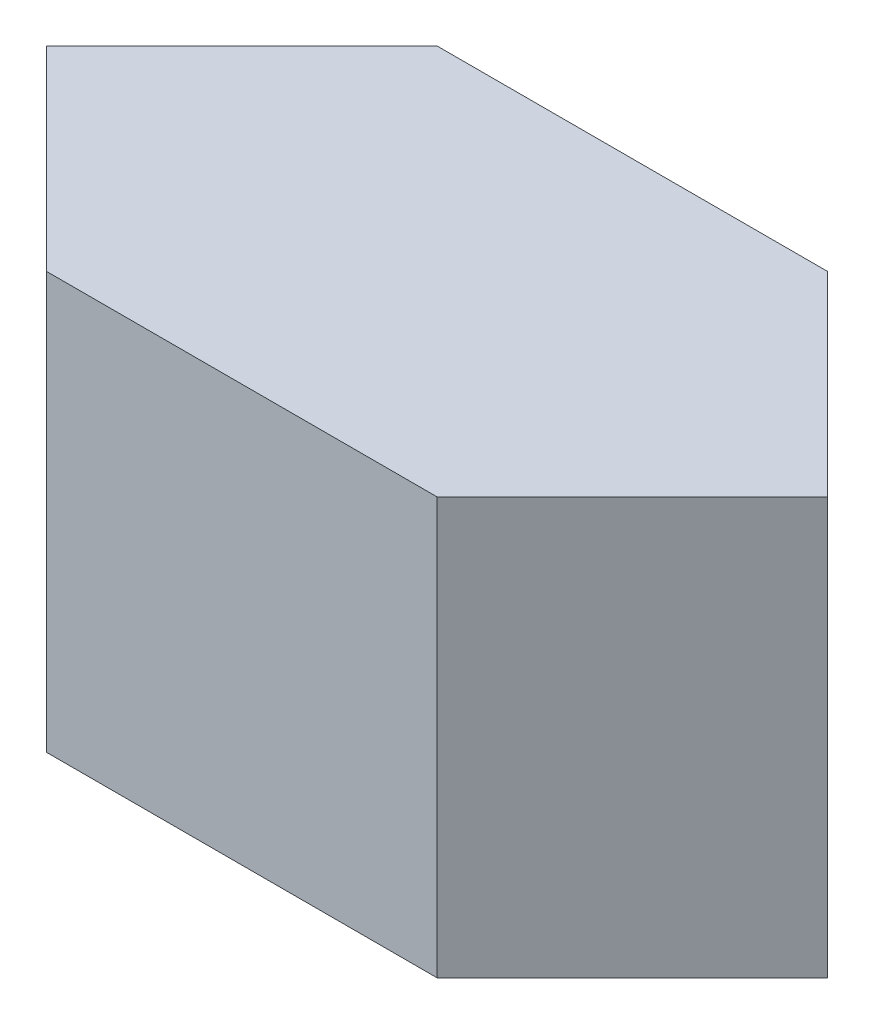
ISO-10303-21;
HEADER;
FILE_DESCRIPTION(('STEP AP214'),'2;1');
FILE_NAME('part.step','',(''),(''),'','','');
FILE_SCHEMA(('AUTOMOTIVE_DESIGN { 1 0 10303 214 1 1 1 1 }'));
ENDSEC;
DATA;
#1=APPLICATION_CONTEXT('core data for automotive mechanical design processes');
#2=APPLICATION_PROTOCOL_DEFINITION('international standard','automotive_design',2000,#1);
#3=PRODUCT_CONTEXT('',#1,'mechanical');
#4=PRODUCT('Part','Part','',(#3));
#5=PRODUCT_RELATED_PRODUCT_CATEGORY('part','',(#4));
#6=PRODUCT_DEFINITION_FORMATION('','',#4);
#7=PRODUCT_DEFINITION_CONTEXT('part definition',#1,'design');
#8=PRODUCT_DEFINITION('design','',#6,#7);
#9=PRODUCT_DEFINITION_SHAPE('','',#8);
#10=(LENGTH_UNIT() NAMED_UNIT(*) SI_UNIT(.MILLI.,.METRE.));
#11=(NAMED_UNIT(*) PLANE_ANGLE_UNIT() SI_UNIT($,.RADIAN.));
#12=(NAMED_UNIT(*) SI_UNIT($,.STERADIAN.) SOLID_ANGLE_UNIT());
#13=UNCERTAINTY_MEASURE_WITH_UNIT(LENGTH_MEASURE(1.E-05),#10,'distance_accuracy_value','');
#14=(GEOMETRIC_REPRESENTATION_CONTEXT(3) GLOBAL_UNCERTAINTY_ASSIGNED_CONTEXT((#13)) GLOBAL_UNIT_ASSIGNED_CONTEXT((#10,
#11,#12)) REPRESENTATION_CONTEXT('',''));
#15=CARTESIAN_POINT('',(0.,0.,0.));
#16=DIRECTION('',(0.,0.,1.));
#17=DIRECTION('',(1.,0.,0.));
#18=AXIS2_PLACEMENT_3D('',#15,#16,#17);
#19=CARTESIAN_POINT('',(-14.9906550373799,32.,15.0093449698787));
#20=DIRECTION('',(0.70666611811519,0.,-0.70754716981132));
#21=DIRECTION('',(-0.70754716981132,0.,-0.70666611811519));
#22=AXIS2_PLACEMENT_3D('',#19,#20,#21);
#23=PLANE('',#22);
#24=DIRECTION('',(0.70754716981132,0.,0.70666611811519));
#25=VECTOR('',#24,1.);
#26=CARTESIAN_POINT('',(-14.9906550373799,0.,15.0093449698787));
#27=LINE('',#26,#25);
#28=CARTESIAN_POINT('',(-30.,0.,0.0186899397483595));
#29=VERTEX_POINT('',#28);
#30=CARTESIAN_POINT('',(-15.,0.,15.0000116437904));
#31=VERTEX_POINT('',#30);
#32=EDGE_CURVE('E123',#29,#31,#27,.T.);
#33=ORIENTED_EDGE('',*,*,#32,.T.);
#34=DIRECTION('',(0.,-1.,0.));
#35=VECTOR('',#34,1.);
#36=CARTESIAN_POINT('',(-15.,32.,15.0000116437904));
#37=LINE('',#36,#35);
#38=CARTESIAN_POINT('',(-15.,32.,15.0000116437904));
#39=VERTEX_POINT('',#38);
#40=EDGE_CURVE('E11',#39,#31,#37,.T.);
#41=ORIENTED_EDGE('',*,*,#40,.F.);
#42=DIRECTION('',(0.70754716981132,0.,0.70666611811519));
#43=VECTOR('',#42,1.);
#44=CARTESIAN_POINT('',(-14.9906550373799,32.,15.0093449698787));
#45=LINE('',#44,#43);
#46=CARTESIAN_POINT('',(-30.,32.,0.0186899397483595));
#47=VERTEX_POINT('',#46);
#48=EDGE_CURVE('E88',#47,#39,#45,.T.);
#49=ORIENTED_EDGE('',*,*,#48,.F.);
#50=DIRECTION('',(0.,-1.,0.));
#51=VECTOR('',#50,1.);
#52=CARTESIAN_POINT('',(-30.,32.,0.0186899397483595));
#53=LINE('',#52,#51);
#54=EDGE_CURVE('E122',#47,#29,#53,.T.);
#55=ORIENTED_EDGE('',*,*,#54,.T.);
#56=EDGE_LOOP('',(#33,#41,#49,#55));
#57=FACE_BOUND('',#56,.T.);
#58=ADVANCED_FACE('F39',(#57),#23,.F.);
#59=CARTESIAN_POINT('',(0.,32.,15.0000116437904));
#60=DIRECTION('',(0.,0.,1.));
#61=DIRECTION('',(1.,0.,0.));
#62=AXIS2_PLACEMENT_3D('',#59,#60,#61);
#63=PLANE('',#62);
#64=DIRECTION('',(-1.,0.,0.));
#65=VECTOR('',#64,1.);
#66=CARTESIAN_POINT('',(0.,0.,15.0000116437904));
#67=LINE('',#66,#65);
#68=CARTESIAN_POINT('',(15.,0.,15.0000116437904));
#69=VERTEX_POINT('',#68);
#70=EDGE_CURVE('E126',#69,#31,#67,.T.);
#71=ORIENTED_EDGE('',*,*,#70,.F.);
#72=DIRECTION('',(0.,-1.,0.));
#73=VECTOR('',#72,1.);
#74=CARTESIAN_POINT('',(15.,32.,15.0000116437904));
#75=LINE('',#74,#73);
#76=CARTESIAN_POINT('',(15.,32.,15.0000116437904));
#77=VERTEX_POINT('',#76);
#78=EDGE_CURVE('E47',#77,#69,#75,.T.);
#79=ORIENTED_EDGE('',*,*,#78,.F.);
#80=DIRECTION('',(-1.,0.,0.));
#81=VECTOR('',#80,1.);
#82=CARTESIAN_POINT('',(0.,32.,15.0000116437904));
#83=LINE('',#82,#81);
#84=EDGE_CURVE('E117',#77,#39,#83,.T.);
#85=ORIENTED_EDGE('',*,*,#84,.T.);
#86=ORIENTED_EDGE('',*,*,#40,.T.);
#87=EDGE_LOOP('',(#71,#79,#85,#86));
#88=FACE_BOUND('',#87,.T.);
#89=ADVANCED_FACE('F143',(#88),#63,.T.);
#90=CARTESIAN_POINT('',(14.9906550373799,32.,15.0093449698787));
#91=DIRECTION('',(0.70666611811519,0.,0.70754716981132));
#92=DIRECTION('',(0.70754716981132,0.,-0.70666611811519));
#93=AXIS2_PLACEMENT_3D('',#90,#91,#92);
#94=PLANE('',#93);
#95=DIRECTION('',(-0.70754716981132,0.,0.70666611811519));
#96=VECTOR('',#95,1.);
#97=CARTESIAN_POINT('',(14.9906550373799,0.,15.0093449698787));
#98=LINE('',#97,#96);
#99=CARTESIAN_POINT('',(30.,0.,0.0186899397483509));
#100=VERTEX_POINT('',#99);
#101=EDGE_CURVE('E129',#100,#69,#98,.T.);
#102=ORIENTED_EDGE('',*,*,#101,.F.);
#103=DIRECTION('',(0.,-1.,0.));
#104=VECTOR('',#103,1.);
#105=CARTESIAN_POINT('',(30.,32.,0.0186899397483509));
#106=LINE('',#105,#104);
#107=CARTESIAN_POINT('',(30.,32.,0.0186899397483509));
#108=VERTEX_POINT('',#107);
#109=EDGE_CURVE('E106',#108,#100,#106,.T.);
#110=ORIENTED_EDGE('',*,*,#109,.F.);
#111=DIRECTION('',(-0.70754716981132,0.,0.70666611811519));
#112=VECTOR('',#111,1.);
#113=CARTESIAN_POINT('',(14.9906550373799,32.,15.0093449698787));
#114=LINE('',#113,#112);
#115=EDGE_CURVE('E115',#108,#77,#114,.T.);
#116=ORIENTED_EDGE('',*,*,#115,.T.);
#117=ORIENTED_EDGE('',*,*,#78,.T.);
#118=EDGE_LOOP('',(#102,#110,#116,#117));
#119=FACE_BOUND('',#118,.T.);
#120=ADVANCED_FACE('F140',(#119),#94,.T.);
#121=CARTESIAN_POINT('',(15.00934496262,32.,-14.9906550301304));
#122=DIRECTION('',(0.707547169811318,0.,-0.706666118115192));
#123=DIRECTION('',(-0.706666118115192,0.,-0.707547169811318));
#124=AXIS2_PLACEMENT_3D('',#121,#122,#123);
#125=PLANE('',#124);
#126=DIRECTION('',(0.706666118115192,0.,0.707547169811318));
#127=VECTOR('',#126,1.);
#128=CARTESIAN_POINT('',(15.00934496262,0.,-14.9906550301304));
#129=LINE('',#128,#127);
#130=CARTESIAN_POINT('',(15.,0.,-15.0000116437903));
#131=VERTEX_POINT('',#130);
#132=EDGE_CURVE('E105',#131,#100,#129,.T.);
#133=ORIENTED_EDGE('',*,*,#132,.F.);
#134=DIRECTION('',(0.,-1.,0.));
#135=VECTOR('',#134,1.);
#136=CARTESIAN_POINT('',(15.,32.,-15.0000116437903));
#137=LINE('',#136,#135);
#138=CARTESIAN_POINT('',(15.,32.,-15.0000116437903));
#139=VERTEX_POINT('',#138);
#140=EDGE_CURVE('E99',#139,#131,#137,.T.);
#141=ORIENTED_EDGE('',*,*,#140,.F.);
#142=DIRECTION('',(0.706666118115192,0.,0.707547169811318));
#143=VECTOR('',#142,1.);
#144=CARTESIAN_POINT('',(15.00934496262,32.,-14.9906550301304));
#145=LINE('',#144,#143);
#146=EDGE_CURVE('E103',#139,#108,#145,.T.);
#147=ORIENTED_EDGE('',*,*,#146,.T.);
#148=ORIENTED_EDGE('',*,*,#109,.T.);
#149=EDGE_LOOP('',(#133,#141,#147,#148));
#150=FACE_BOUND('',#149,.T.);
#151=ADVANCED_FACE('F101',(#150),#125,.T.);
#152=CARTESIAN_POINT('',(0.,32.,-15.0000116437903));
#153=DIRECTION('',(0.,0.,1.));
#154=DIRECTION('',(1.,0.,0.));
#155=AXIS2_PLACEMENT_3D('',#152,#153,#154);
#156=PLANE('',#155);
#157=DIRECTION('',(-1.,0.,0.));
#158=VECTOR('',#157,1.);
#159=CARTESIAN_POINT('',(0.,0.,-15.0000116437903));
#160=LINE('',#159,#158);
#161=CARTESIAN_POINT('',(-15.,0.,-15.0000116437903));
#162=VERTEX_POINT('',#161);
#163=EDGE_CURVE('E76',#131,#162,#160,.T.);
#164=ORIENTED_EDGE('',*,*,#163,.T.);
#165=DIRECTION('',(0.,-1.,0.));
#166=VECTOR('',#165,1.);
#167=CARTESIAN_POINT('',(-15.,32.,-15.0000116437903));
#168=LINE('',#167,#166);
#169=CARTESIAN_POINT('',(-15.,32.,-15.0000116437903));
#170=VERTEX_POINT('',#169);
#171=EDGE_CURVE('E107',#170,#162,#168,.T.);
#172=ORIENTED_EDGE('',*,*,#171,.F.);
#173=DIRECTION('',(-1.,0.,0.));
#174=VECTOR('',#173,1.);
#175=CARTESIAN_POINT('',(0.,32.,-15.0000116437903));
#176=LINE('',#175,#174);
#177=EDGE_CURVE('E109',#139,#170,#176,.T.);
#178=ORIENTED_EDGE('',*,*,#177,.F.);
#179=ORIENTED_EDGE('',*,*,#140,.T.);
#180=EDGE_LOOP('',(#164,#172,#178,#179));
#181=FACE_BOUND('',#180,.T.);
#182=ADVANCED_FACE('F110',(#181),#156,.F.);
#183=CARTESIAN_POINT('',(-15.0093449626201,32.,-14.9906550301303));
#184=DIRECTION('',(0.707547169811318,0.,0.706666118115192));
#185=DIRECTION('',(0.706666118115192,0.,-0.707547169811318));
#186=AXIS2_PLACEMENT_3D('',#183,#184,#185);
#187=PLANE('',#186);
#188=DIRECTION('',(-0.706666118115192,0.,0.707547169811318));
#189=VECTOR('',#188,1.);
#190=CARTESIAN_POINT('',(-15.0093449626201,0.,-14.9906550301303));
#191=LINE('',#190,#189);
#192=EDGE_CURVE('E82',#162,#29,#191,.T.);
#193=ORIENTED_EDGE('',*,*,#192,.T.);
#194=ORIENTED_EDGE('',*,*,#54,.F.);
#195=DIRECTION('',(-0.706666118115192,0.,0.707547169811318));
#196=VECTOR('',#195,1.);
#197=CARTESIAN_POINT('',(-15.0093449626201,32.,-14.9906550301303));
#198=LINE('',#197,#196);
#199=EDGE_CURVE('E55',#170,#47,#198,.T.);
#200=ORIENTED_EDGE('',*,*,#199,.F.);
#201=ORIENTED_EDGE('',*,*,#171,.T.);
#202=EDGE_LOOP('',(#193,#194,#200,#201));
#203=FACE_BOUND('',#202,.T.);
#204=ADVANCED_FACE('F148',(#203),#187,.F.);
#205=CARTESIAN_POINT('',(0.,32.,0.));
#206=DIRECTION('',(0.,1.,0.));
#207=DIRECTION('',(0.,0.,1.));
#208=AXIS2_PLACEMENT_3D('',#205,#206,#207);
#209=PLANE('',#208);
#210=ORIENTED_EDGE('',*,*,#48,.T.);
#211=ORIENTED_EDGE('',*,*,#84,.F.);
#212=ORIENTED_EDGE('',*,*,#115,.F.);
#213=ORIENTED_EDGE('',*,*,#146,.F.);
#214=ORIENTED_EDGE('',*,*,#177,.T.);
#215=ORIENTED_EDGE('',*,*,#199,.T.);
#216=EDGE_LOOP('',(#210,#211,#212,#213,#214,#215));
#217=FACE_BOUND('',#216,.T.);
#218=ADVANCED_FACE('F113',(#217),#209,.T.);
#219=CARTESIAN_POINT('',(0.,0.,0.));
#220=DIRECTION('',(0.,1.,0.));
#221=DIRECTION('',(0.,0.,1.));
#222=AXIS2_PLACEMENT_3D('',#219,#220,#221);
#223=PLANE('',#222);
#224=ORIENTED_EDGE('',*,*,#32,.F.);
#225=ORIENTED_EDGE('',*,*,#192,.F.);
#226=ORIENTED_EDGE('',*,*,#163,.F.);
#227=ORIENTED_EDGE('',*,*,#132,.T.);
#228=ORIENTED_EDGE('',*,*,#101,.T.);
#229=ORIENTED_EDGE('',*,*,#70,.T.);
#230=EDGE_LOOP('',(#224,#225,#226,#227,#228,#229));
#231=FACE_BOUND('',#230,.T.);
#232=ADVANCED_FACE('F146',(#231),#223,.F.);
#233=CLOSED_SHELL('',(#58,#89,#120,#151,#182,#204,#218,#232));
#234=MANIFOLD_SOLID_BREP('B2',#233);
#235=ADVANCED_BREP_SHAPE_REPRESENTATION('',(#18,#234),#14);
#236=SHAPE_DEFINITION_REPRESENTATION(#9,#235);
ENDSEC;
END-ISO-10303-21;
